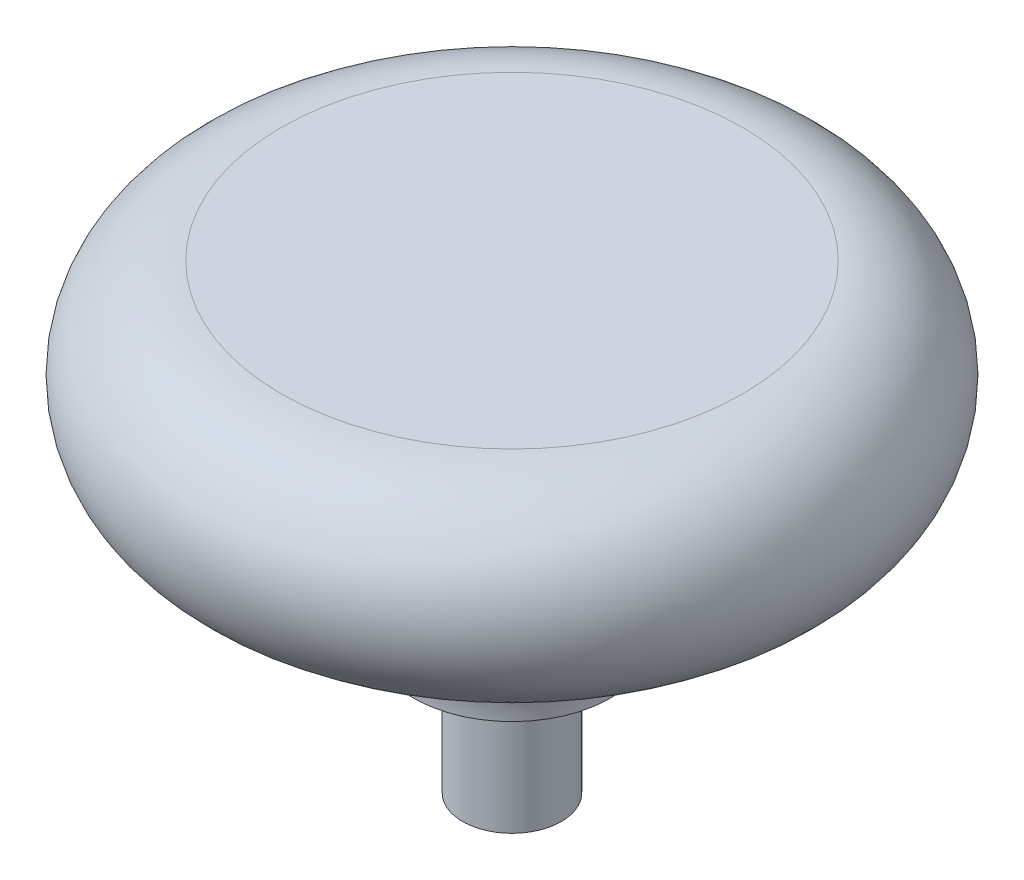
ISO-10303-21;
HEADER;
FILE_DESCRIPTION(('STEP AP214'),'2;1');
FILE_NAME('part.step','',(''),(''),'','','');
FILE_SCHEMA(('AUTOMOTIVE_DESIGN { 1 0 10303 214 1 1 1 1 }'));
ENDSEC;
DATA;
#1=APPLICATION_CONTEXT('core data for automotive mechanical design processes');
#2=APPLICATION_PROTOCOL_DEFINITION('international standard','automotive_design',2000,#1);
#3=PRODUCT_CONTEXT('',#1,'mechanical');
#4=PRODUCT('Part','Part','',(#3));
#5=PRODUCT_RELATED_PRODUCT_CATEGORY('part','',(#4));
#6=PRODUCT_DEFINITION_FORMATION('','',#4);
#7=PRODUCT_DEFINITION_CONTEXT('part definition',#1,'design');
#8=PRODUCT_DEFINITION('design','',#6,#7);
#9=PRODUCT_DEFINITION_SHAPE('','',#8);
#10=(LENGTH_UNIT() NAMED_UNIT(*) SI_UNIT(.MILLI.,.METRE.));
#11=(NAMED_UNIT(*) PLANE_ANGLE_UNIT() SI_UNIT($,.RADIAN.));
#12=(NAMED_UNIT(*) SI_UNIT($,.STERADIAN.) SOLID_ANGLE_UNIT());
#13=UNCERTAINTY_MEASURE_WITH_UNIT(LENGTH_MEASURE(1.E-05),#10,'distance_accuracy_value','');
#14=(GEOMETRIC_REPRESENTATION_CONTEXT(3) GLOBAL_UNCERTAINTY_ASSIGNED_CONTEXT((#13)) GLOBAL_UNIT_ASSIGNED_CONTEXT((#10,
#11,#12)) REPRESENTATION_CONTEXT('',''));
#15=CARTESIAN_POINT('',(0.,0.,0.));
#16=DIRECTION('',(0.,0.,1.));
#17=DIRECTION('',(1.,0.,0.));
#18=AXIS2_PLACEMENT_3D('',#15,#16,#17);
#19=CARTESIAN_POINT('',(2.38,0.,0.));
#20=DIRECTION('',(0.,-1.,0.));
#21=DIRECTION('',(0.,0.,-1.));
#22=AXIS2_PLACEMENT_3D('',#19,#20,#21);
#23=PLANE('',#22);
#24=CARTESIAN_POINT('',(0.,0.,0.));
#25=DIRECTION('',(0.,-1.,0.));
#26=DIRECTION('',(0.,0.,-1.));
#27=AXIS2_PLACEMENT_3D('',#24,#25,#26);
#28=CIRCLE('',#27,2.38);
#29=CARTESIAN_POINT('',(0.,0.,-2.38));
#30=VERTEX_POINT('',#29);
#31=EDGE_CURVE('E10',#30,#30,#28,.T.);
#32=ORIENTED_EDGE('',*,*,#31,.T.);
#33=EDGE_LOOP('',(#32));
#34=FACE_BOUND('',#33,.T.);
#35=ADVANCED_FACE('F43',(#34),#23,.T.);
#36=CARTESIAN_POINT('',(0.,0.,0.));
#37=DIRECTION('',(0.,-1.,0.));
#38=DIRECTION('',(0.,0.,-1.));
#39=AXIS2_PLACEMENT_3D('',#36,#37,#38);
#40=CYLINDRICAL_SURFACE('',#39,2.38);
#41=CARTESIAN_POINT('',(0.,6.35,0.));
#42=DIRECTION('',(0.,-1.,0.));
#43=DIRECTION('',(0.,0.,-1.));
#44=AXIS2_PLACEMENT_3D('',#41,#42,#43);
#45=CIRCLE('',#44,2.38);
#46=CARTESIAN_POINT('',(0.,6.35,-2.38));
#47=VERTEX_POINT('',#46);
#48=EDGE_CURVE('E50',#47,#47,#45,.T.);
#49=ORIENTED_EDGE('',*,*,#48,.T.);
#50=EDGE_LOOP('',(#49));
#51=FACE_BOUND('',#50,.T.);
#52=ORIENTED_EDGE('',*,*,#31,.F.);
#53=EDGE_LOOP('',(#52));
#54=FACE_BOUND('',#53,.T.);
#55=ADVANCED_FACE('F83',(#51,#54),#40,.T.);
#56=CARTESIAN_POINT('',(2.38,6.35,0.));
#57=DIRECTION('',(0.,-1.,0.));
#58=DIRECTION('',(0.,0.,-1.));
#59=AXIS2_PLACEMENT_3D('',#56,#57,#58);
#60=PLANE('',#59);
#61=CARTESIAN_POINT('',(0.,6.35,0.));
#62=DIRECTION('',(0.,-1.,0.));
#63=DIRECTION('',(0.,0.,-1.));
#64=AXIS2_PLACEMENT_3D('',#61,#62,#63);
#65=CIRCLE('',#64,4.765);
#66=CARTESIAN_POINT('',(0.,6.35,-4.765));
#67=VERTEX_POINT('',#66);
#68=EDGE_CURVE('E55',#67,#67,#65,.T.);
#69=ORIENTED_EDGE('',*,*,#68,.T.);
#70=EDGE_LOOP('',(#69));
#71=FACE_BOUND('',#70,.T.);
#72=ORIENTED_EDGE('',*,*,#48,.F.);
#73=EDGE_LOOP('',(#72));
#74=FACE_BOUND('',#73,.T.);
#75=ADVANCED_FACE('F87',(#71,#74),#60,.T.);
#76=CARTESIAN_POINT('',(0.,6.35,0.));
#77=DIRECTION('',(0.,-1.,0.));
#78=DIRECTION('',(0.,0.,-1.));
#79=AXIS2_PLACEMENT_3D('',#76,#77,#78);
#80=TOROIDAL_SURFACE('',#79,11.115,6.35);
#81=CARTESIAN_POINT('',(0.,12.6999993569339,0.));
#82=DIRECTION('',(0.,-1.,0.));
#83=DIRECTION('',(0.,0.,-1.));
#84=AXIS2_PLACEMENT_3D('',#81,#82,#83);
#85=CIRCLE('',#84,11.1178577857786);
#86=CARTESIAN_POINT('',(0.,12.6999993569339,-11.1178577857786));
#87=VERTEX_POINT('',#86);
#88=EDGE_CURVE('E60',#87,#87,#85,.T.);
#89=ORIENTED_EDGE('',*,*,#88,.T.);
#90=EDGE_LOOP('',(#89));
#91=FACE_BOUND('',#90,.T.);
#92=ORIENTED_EDGE('',*,*,#68,.F.);
#93=EDGE_LOOP('',(#92));
#94=FACE_BOUND('',#93,.T.);
#95=ADVANCED_FACE('F80',(#91,#94),#80,.F.);
#96=CARTESIAN_POINT('',(0.,17.4599988748874,0.));
#97=DIRECTION('',(0.,-1.,0.));
#98=DIRECTION('',(0.,0.,-1.));
#99=AXIS2_PLACEMENT_3D('',#96,#97,#98);
#100=TOROIDAL_SURFACE('',#99,11.12,4.76);
#101=CARTESIAN_POINT('',(0.,22.2199988748874,0.));
#102=DIRECTION('',(0.,-1.,0.));
#103=DIRECTION('',(0.,0.,-1.));
#104=AXIS2_PLACEMENT_3D('',#101,#102,#103);
#105=CIRCLE('',#104,11.12);
#106=CARTESIAN_POINT('',(0.,22.2199988748874,-11.12));
#107=VERTEX_POINT('',#106);
#108=EDGE_CURVE('E66',#107,#107,#105,.T.);
#109=ORIENTED_EDGE('',*,*,#108,.T.);
#110=EDGE_LOOP('',(#109));
#111=FACE_BOUND('',#110,.T.);
#112=ORIENTED_EDGE('',*,*,#88,.F.);
#113=EDGE_LOOP('',(#112));
#114=FACE_BOUND('',#113,.T.);
#115=ADVANCED_FACE('F71',(#111,#114),#100,.T.);
#116=CARTESIAN_POINT('',(11.12,22.2199988748874,0.));
#117=DIRECTION('',(0.,1.,0.));
#118=DIRECTION('',(0.,0.,1.));
#119=AXIS2_PLACEMENT_3D('',#116,#117,#118);
#120=PLANE('',#119);
#121=ORIENTED_EDGE('',*,*,#108,.F.);
#122=EDGE_LOOP('',(#121));
#123=FACE_BOUND('',#122,.T.);
#124=ADVANCED_FACE('F74',(#123),#120,.T.);
#125=CLOSED_SHELL('',(#35,#55,#75,#95,#115,#124));
#126=MANIFOLD_SOLID_BREP('B2',#125);
#127=ADVANCED_BREP_SHAPE_REPRESENTATION('',(#18,#126),#14);
#128=SHAPE_DEFINITION_REPRESENTATION(#9,#127);
ENDSEC;
END-ISO-10303-21;
